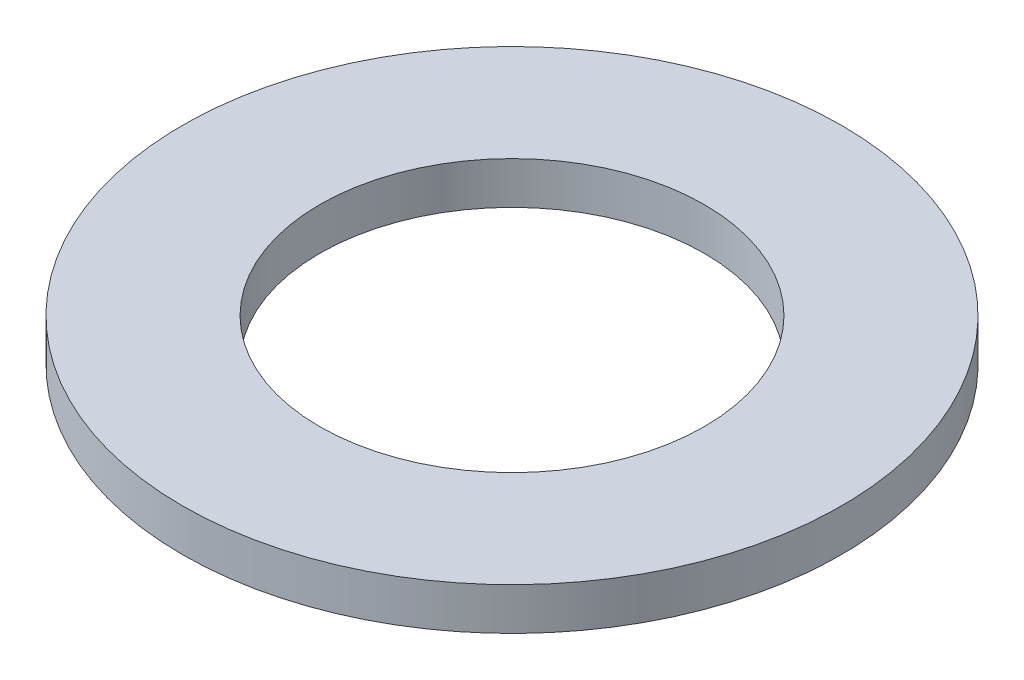
ISO-10303-21;
HEADER;
FILE_DESCRIPTION(('STEP AP214'),'2;1');
FILE_NAME('part.step','',(''),(''),'','','');
FILE_SCHEMA(('AUTOMOTIVE_DESIGN { 1 0 10303 214 1 1 1 1 }'));
ENDSEC;
DATA;
#1=APPLICATION_CONTEXT('core data for automotive mechanical design processes');
#2=APPLICATION_PROTOCOL_DEFINITION('international standard','automotive_design',2000,#1);
#3=PRODUCT_CONTEXT('',#1,'mechanical');
#4=PRODUCT('Part','Part','',(#3));
#5=PRODUCT_RELATED_PRODUCT_CATEGORY('part','',(#4));
#6=PRODUCT_DEFINITION_FORMATION('','',#4);
#7=PRODUCT_DEFINITION_CONTEXT('part definition',#1,'design');
#8=PRODUCT_DEFINITION('design','',#6,#7);
#9=PRODUCT_DEFINITION_SHAPE('','',#8);
#10=(LENGTH_UNIT() NAMED_UNIT(*) SI_UNIT(.MILLI.,.METRE.));
#11=(NAMED_UNIT(*) PLANE_ANGLE_UNIT() SI_UNIT($,.RADIAN.));
#12=(NAMED_UNIT(*) SI_UNIT($,.STERADIAN.) SOLID_ANGLE_UNIT());
#13=UNCERTAINTY_MEASURE_WITH_UNIT(LENGTH_MEASURE(1.E-05),#10,'distance_accuracy_value','');
#14=(GEOMETRIC_REPRESENTATION_CONTEXT(3) GLOBAL_UNCERTAINTY_ASSIGNED_CONTEXT((#13)) GLOBAL_UNIT_ASSIGNED_CONTEXT((#10,
#11,#12)) REPRESENTATION_CONTEXT('',''));
#15=CARTESIAN_POINT('',(0.,0.,0.));
#16=DIRECTION('',(0.,0.,1.));
#17=DIRECTION('',(1.,0.,0.));
#18=AXIS2_PLACEMENT_3D('',#15,#16,#17);
#19=CARTESIAN_POINT('',(0.,6.35,0.));
#20=DIRECTION('',(0.,1.,0.));
#21=DIRECTION('',(0.,0.,1.));
#22=AXIS2_PLACEMENT_3D('',#19,#20,#21);
#23=PLANE('',#22);
#24=CARTESIAN_POINT('',(0.,6.35,0.));
#25=DIRECTION('',(0.,1.,0.));
#26=DIRECTION('',(0.,0.,1.));
#27=AXIS2_PLACEMENT_3D('',#24,#25,#26);
#28=CIRCLE('',#27,49.53);
#29=CARTESIAN_POINT('',(0.,6.35,49.53));
#30=VERTEX_POINT('',#29);
#31=EDGE_CURVE('E10',#30,#30,#28,.T.);
#32=ORIENTED_EDGE('',*,*,#31,.T.);
#33=EDGE_LOOP('',(#32));
#34=FACE_BOUND('',#33,.T.);
#35=CARTESIAN_POINT('',(0.,6.35,0.));
#36=DIRECTION('',(0.,1.,0.));
#37=DIRECTION('',(0.,0.,1.));
#38=AXIS2_PLACEMENT_3D('',#35,#36,#37);
#39=CIRCLE('',#38,28.9052);
#40=CARTESIAN_POINT('',(0.,6.35,28.9052));
#41=VERTEX_POINT('',#40);
#42=EDGE_CURVE('E50',#41,#41,#39,.T.);
#43=ORIENTED_EDGE('',*,*,#42,.F.);
#44=EDGE_LOOP('',(#43));
#45=FACE_BOUND('',#44,.T.);
#46=ADVANCED_FACE('F39',(#34,#45),#23,.T.);
#47=CARTESIAN_POINT('',(0.,0.,0.));
#48=DIRECTION('',(0.,1.,0.));
#49=DIRECTION('',(0.,0.,1.));
#50=AXIS2_PLACEMENT_3D('',#47,#48,#49);
#51=PLANE('',#50);
#52=CARTESIAN_POINT('',(0.,0.,0.));
#53=DIRECTION('',(0.,1.,0.));
#54=DIRECTION('',(0.,0.,1.));
#55=AXIS2_PLACEMENT_3D('',#52,#53,#54);
#56=CIRCLE('',#55,49.53);
#57=CARTESIAN_POINT('',(0.,0.,49.53));
#58=VERTEX_POINT('',#57);
#59=EDGE_CURVE('E43',#58,#58,#56,.T.);
#60=ORIENTED_EDGE('',*,*,#59,.F.);
#61=EDGE_LOOP('',(#60));
#62=FACE_BOUND('',#61,.T.);
#63=CARTESIAN_POINT('',(0.,0.,0.));
#64=DIRECTION('',(0.,1.,0.));
#65=DIRECTION('',(0.,0.,1.));
#66=AXIS2_PLACEMENT_3D('',#63,#64,#65);
#67=CIRCLE('',#66,28.9052);
#68=CARTESIAN_POINT('',(0.,0.,28.9052));
#69=VERTEX_POINT('',#68);
#70=EDGE_CURVE('E52',#69,#69,#67,.T.);
#71=ORIENTED_EDGE('',*,*,#70,.T.);
#72=EDGE_LOOP('',(#71));
#73=FACE_BOUND('',#72,.T.);
#74=ADVANCED_FACE('F62',(#62,#73),#51,.F.);
#75=CARTESIAN_POINT('',(0.,6.35,0.));
#76=DIRECTION('',(0.,-1.,0.));
#77=DIRECTION('',(0.,0.,-1.));
#78=AXIS2_PLACEMENT_3D('',#75,#76,#77);
#79=CYLINDRICAL_SURFACE('',#78,49.53);
#80=ORIENTED_EDGE('',*,*,#31,.F.);
#81=EDGE_LOOP('',(#80));
#82=FACE_BOUND('',#81,.T.);
#83=ORIENTED_EDGE('',*,*,#59,.T.);
#84=EDGE_LOOP('',(#83));
#85=FACE_BOUND('',#84,.T.);
#86=ADVANCED_FACE('F41',(#82,#85),#79,.T.);
#87=CARTESIAN_POINT('',(0.,6.35,0.));
#88=DIRECTION('',(0.,-1.,0.));
#89=DIRECTION('',(0.,0.,-1.));
#90=AXIS2_PLACEMENT_3D('',#87,#88,#89);
#91=CYLINDRICAL_SURFACE('',#90,28.9052);
#92=ORIENTED_EDGE('',*,*,#42,.T.);
#93=EDGE_LOOP('',(#92));
#94=FACE_BOUND('',#93,.T.);
#95=ORIENTED_EDGE('',*,*,#70,.F.);
#96=EDGE_LOOP('',(#95));
#97=FACE_BOUND('',#96,.T.);
#98=ADVANCED_FACE('F58',(#94,#97),#91,.F.);
#99=CLOSED_SHELL('',(#46,#74,#86,#98));
#100=MANIFOLD_SOLID_BREP('B2',#99);
#101=ADVANCED_BREP_SHAPE_REPRESENTATION('',(#18,#100),#14);
#102=SHAPE_DEFINITION_REPRESENTATION(#9,#101);
ENDSEC;
END-ISO-10303-21;
